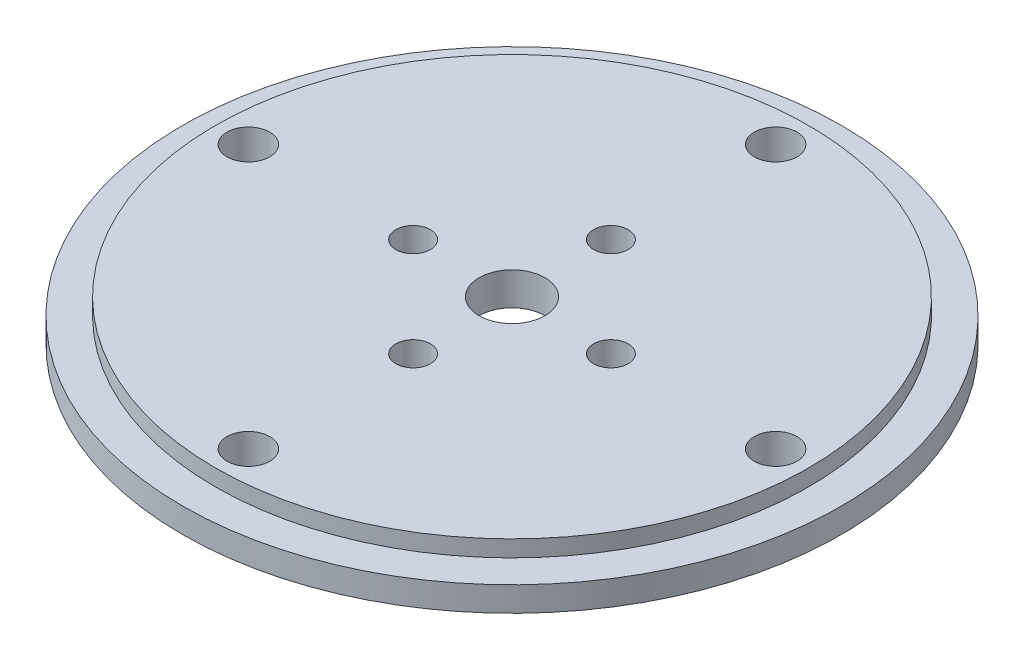
ISO-10303-21;
HEADER;
FILE_DESCRIPTION(('STEP AP214'),'2;1');
FILE_NAME('part.step','',(''),(''),'','','');
FILE_SCHEMA(('AUTOMOTIVE_DESIGN { 1 0 10303 214 1 1 1 1 }'));
ENDSEC;
DATA;
#1=APPLICATION_CONTEXT('core data for automotive mechanical design processes');
#2=APPLICATION_PROTOCOL_DEFINITION('international standard','automotive_design',2000,#1);
#3=PRODUCT_CONTEXT('',#1,'mechanical');
#4=PRODUCT('Part','Part','',(#3));
#5=PRODUCT_RELATED_PRODUCT_CATEGORY('part','',(#4));
#6=PRODUCT_DEFINITION_FORMATION('','',#4);
#7=PRODUCT_DEFINITION_CONTEXT('part definition',#1,'design');
#8=PRODUCT_DEFINITION('design','',#6,#7);
#9=PRODUCT_DEFINITION_SHAPE('','',#8);
#10=(LENGTH_UNIT() NAMED_UNIT(*) SI_UNIT(.MILLI.,.METRE.));
#11=(NAMED_UNIT(*) PLANE_ANGLE_UNIT() SI_UNIT($,.RADIAN.));
#12=(NAMED_UNIT(*) SI_UNIT($,.STERADIAN.) SOLID_ANGLE_UNIT());
#13=UNCERTAINTY_MEASURE_WITH_UNIT(LENGTH_MEASURE(1.E-05),#10,'distance_accuracy_value','');
#14=(GEOMETRIC_REPRESENTATION_CONTEXT(3) GLOBAL_UNCERTAINTY_ASSIGNED_CONTEXT((#13)) GLOBAL_UNIT_ASSIGNED_CONTEXT((#10,
#11,#12)) REPRESENTATION_CONTEXT('',''));
#15=CARTESIAN_POINT('',(0.,0.,0.));
#16=DIRECTION('',(0.,0.,1.));
#17=DIRECTION('',(1.,0.,0.));
#18=AXIS2_PLACEMENT_3D('',#15,#16,#17);
#19=CARTESIAN_POINT('',(-3.35182208528941E-13,5.,-32.));
#20=DIRECTION('',(0.,-1.,0.));
#21=DIRECTION('',(0.,0.,-1.));
#22=AXIS2_PLACEMENT_3D('',#19,#20,#21);
#23=CYLINDRICAL_SURFACE('',#22,2.6);
#24=CARTESIAN_POINT('',(-3.35182208528941E-13,5.,-32.));
#25=DIRECTION('',(0.,-1.,0.));
#26=DIRECTION('',(0.,0.,-1.));
#27=AXIS2_PLACEMENT_3D('',#24,#25,#26);
#28=CIRCLE('',#27,2.6);
#29=CARTESIAN_POINT('',(-3.35182208528941E-13,5.,-34.6));
#30=VERTEX_POINT('',#29);
#31=EDGE_CURVE('E74',#30,#30,#28,.T.);
#32=ORIENTED_EDGE('',*,*,#31,.F.);
#33=EDGE_LOOP('',(#32));
#34=FACE_BOUND('',#33,.T.);
#35=CARTESIAN_POINT('',(-3.35182208528941E-13,1.,-32.));
#36=DIRECTION('',(0.,-1.,0.));
#37=DIRECTION('',(0.,0.,-1.));
#38=AXIS2_PLACEMENT_3D('',#35,#36,#37);
#39=CIRCLE('',#38,2.6);
#40=CARTESIAN_POINT('',(-3.35182208528941E-13,1.,-34.6));
#41=VERTEX_POINT('',#40);
#42=EDGE_CURVE('E41',#41,#41,#39,.F.);
#43=ORIENTED_EDGE('',*,*,#42,.F.);
#44=EDGE_LOOP('',(#43));
#45=FACE_BOUND('',#44,.T.);
#46=ADVANCED_FACE('F37',(#34,#45),#23,.F.);
#47=CARTESIAN_POINT('',(32.,5.,-2.23454805685961E-13));
#48=DIRECTION('',(0.,-1.,0.));
#49=DIRECTION('',(0.,0.,-1.));
#50=AXIS2_PLACEMENT_3D('',#47,#48,#49);
#51=CYLINDRICAL_SURFACE('',#50,2.6);
#52=CARTESIAN_POINT('',(32.,5.,-2.23454805685961E-13));
#53=DIRECTION('',(0.,-1.,0.));
#54=DIRECTION('',(0.,0.,-1.));
#55=AXIS2_PLACEMENT_3D('',#52,#53,#54);
#56=CIRCLE('',#55,2.6);
#57=CARTESIAN_POINT('',(32.,5.,-2.60000000000022));
#58=VERTEX_POINT('',#57);
#59=EDGE_CURVE('E78',#58,#58,#56,.T.);
#60=ORIENTED_EDGE('',*,*,#59,.F.);
#61=EDGE_LOOP('',(#60));
#62=FACE_BOUND('',#61,.T.);
#63=CARTESIAN_POINT('',(32.,1.,-2.23454805685961E-13));
#64=DIRECTION('',(0.,-1.,0.));
#65=DIRECTION('',(0.,0.,-1.));
#66=AXIS2_PLACEMENT_3D('',#63,#64,#65);
#67=CIRCLE('',#66,2.6);
#68=CARTESIAN_POINT('',(32.,1.,-2.60000000000022));
#69=VERTEX_POINT('',#68);
#70=EDGE_CURVE('E69',#69,#69,#67,.F.);
#71=ORIENTED_EDGE('',*,*,#70,.F.);
#72=EDGE_LOOP('',(#71));
#73=FACE_BOUND('',#72,.T.);
#74=ADVANCED_FACE('F151',(#62,#73),#51,.F.);
#75=CARTESIAN_POINT('',(1.1172740284298E-13,5.,32.));
#76=DIRECTION('',(0.,-1.,0.));
#77=DIRECTION('',(0.,0.,-1.));
#78=AXIS2_PLACEMENT_3D('',#75,#76,#77);
#79=CYLINDRICAL_SURFACE('',#78,2.6);
#80=CARTESIAN_POINT('',(1.1172740284298E-13,5.,32.));
#81=DIRECTION('',(0.,-1.,0.));
#82=DIRECTION('',(0.,0.,-1.));
#83=AXIS2_PLACEMENT_3D('',#80,#81,#82);
#84=CIRCLE('',#83,2.6);
#85=CARTESIAN_POINT('',(1.1172740284298E-13,5.,29.4));
#86=VERTEX_POINT('',#85);
#87=EDGE_CURVE('E83',#86,#86,#84,.T.);
#88=ORIENTED_EDGE('',*,*,#87,.F.);
#89=EDGE_LOOP('',(#88));
#90=FACE_BOUND('',#89,.T.);
#91=CARTESIAN_POINT('',(1.1172740284298E-13,1.,32.));
#92=DIRECTION('',(0.,-1.,0.));
#93=DIRECTION('',(0.,0.,-1.));
#94=AXIS2_PLACEMENT_3D('',#91,#92,#93);
#95=CIRCLE('',#94,2.6);
#96=CARTESIAN_POINT('',(1.1172740284298E-13,1.,29.4));
#97=VERTEX_POINT('',#96);
#98=EDGE_CURVE('E66',#97,#97,#95,.F.);
#99=ORIENTED_EDGE('',*,*,#98,.F.);
#100=EDGE_LOOP('',(#99));
#101=FACE_BOUND('',#100,.T.);
#102=ADVANCED_FACE('F145',(#90,#101),#79,.F.);
#103=CARTESIAN_POINT('',(-32.,5.,0.));
#104=DIRECTION('',(0.,-1.,0.));
#105=DIRECTION('',(0.,0.,-1.));
#106=AXIS2_PLACEMENT_3D('',#103,#104,#105);
#107=CYLINDRICAL_SURFACE('',#106,2.6);
#108=CARTESIAN_POINT('',(-32.,5.,0.));
#109=DIRECTION('',(0.,-1.,0.));
#110=DIRECTION('',(0.,0.,-1.));
#111=AXIS2_PLACEMENT_3D('',#108,#109,#110);
#112=CIRCLE('',#111,2.6);
#113=CARTESIAN_POINT('',(-32.,5.,-2.6));
#114=VERTEX_POINT('',#113);
#115=EDGE_CURVE('E92',#114,#114,#112,.T.);
#116=ORIENTED_EDGE('',*,*,#115,.F.);
#117=EDGE_LOOP('',(#116));
#118=FACE_BOUND('',#117,.T.);
#119=CARTESIAN_POINT('',(-32.,1.,0.));
#120=DIRECTION('',(0.,-1.,0.));
#121=DIRECTION('',(0.,0.,-1.));
#122=AXIS2_PLACEMENT_3D('',#119,#120,#121);
#123=CIRCLE('',#122,2.6);
#124=CARTESIAN_POINT('',(-32.,1.,-2.6));
#125=VERTEX_POINT('',#124);
#126=EDGE_CURVE('E63',#125,#125,#123,.F.);
#127=ORIENTED_EDGE('',*,*,#126,.F.);
#128=EDGE_LOOP('',(#127));
#129=FACE_BOUND('',#128,.T.);
#130=ADVANCED_FACE('F139',(#118,#129),#107,.F.);
#131=CARTESIAN_POINT('',(0.,5.,0.));
#132=DIRECTION('',(0.,-1.,0.));
#133=DIRECTION('',(0.,0.,-1.));
#134=AXIS2_PLACEMENT_3D('',#131,#132,#133);
#135=CYLINDRICAL_SURFACE('',#134,4.);
#136=CARTESIAN_POINT('',(0.,5.,0.));
#137=DIRECTION('',(0.,-1.,0.));
#138=DIRECTION('',(0.,0.,-1.));
#139=AXIS2_PLACEMENT_3D('',#136,#137,#138);
#140=CIRCLE('',#139,4.);
#141=CARTESIAN_POINT('',(0.,5.,-4.));
#142=VERTEX_POINT('',#141);
#143=EDGE_CURVE('E108',#142,#142,#140,.T.);
#144=ORIENTED_EDGE('',*,*,#143,.F.);
#145=EDGE_LOOP('',(#144));
#146=FACE_BOUND('',#145,.T.);
#147=CARTESIAN_POINT('',(0.,1.,0.));
#148=DIRECTION('',(0.,-1.,0.));
#149=DIRECTION('',(0.,0.,-1.));
#150=AXIS2_PLACEMENT_3D('',#147,#148,#149);
#151=CIRCLE('',#150,4.);
#152=CARTESIAN_POINT('',(0.,1.,-4.));
#153=VERTEX_POINT('',#152);
#154=EDGE_CURVE('E101',#153,#153,#151,.F.);
#155=ORIENTED_EDGE('',*,*,#154,.F.);
#156=EDGE_LOOP('',(#155));
#157=FACE_BOUND('',#156,.T.);
#158=ADVANCED_FACE('F126',(#146,#157),#135,.F.);
#159=CARTESIAN_POINT('',(0.,5.,12.));
#160=DIRECTION('',(0.,-1.,0.));
#161=DIRECTION('',(0.,0.,-1.));
#162=AXIS2_PLACEMENT_3D('',#159,#160,#161);
#163=CYLINDRICAL_SURFACE('',#162,2.1);
#164=CARTESIAN_POINT('',(0.,5.,12.));
#165=DIRECTION('',(0.,-1.,0.));
#166=DIRECTION('',(0.,0.,-1.));
#167=AXIS2_PLACEMENT_3D('',#164,#165,#166);
#168=CIRCLE('',#167,2.1);
#169=CARTESIAN_POINT('',(0.,5.,9.9));
#170=VERTEX_POINT('',#169);
#171=EDGE_CURVE('E112',#170,#170,#168,.T.);
#172=ORIENTED_EDGE('',*,*,#171,.F.);
#173=EDGE_LOOP('',(#172));
#174=FACE_BOUND('',#173,.T.);
#175=CARTESIAN_POINT('',(0.,1.,12.));
#176=DIRECTION('',(0.,-1.,0.));
#177=DIRECTION('',(0.,0.,-1.));
#178=AXIS2_PLACEMENT_3D('',#175,#176,#177);
#179=CIRCLE('',#178,2.1);
#180=CARTESIAN_POINT('',(0.,1.,9.9));
#181=VERTEX_POINT('',#180);
#182=EDGE_CURVE('E98',#181,#181,#179,.F.);
#183=ORIENTED_EDGE('',*,*,#182,.F.);
#184=EDGE_LOOP('',(#183));
#185=FACE_BOUND('',#184,.T.);
#186=ADVANCED_FACE('F122',(#174,#185),#163,.F.);
#187=CARTESIAN_POINT('',(12.,5.,0.));
#188=DIRECTION('',(0.,-1.,0.));
#189=DIRECTION('',(0.,0.,-1.));
#190=AXIS2_PLACEMENT_3D('',#187,#188,#189);
#191=CYLINDRICAL_SURFACE('',#190,2.1);
#192=CARTESIAN_POINT('',(12.,5.,0.));
#193=DIRECTION('',(0.,-1.,0.));
#194=DIRECTION('',(0.,0.,-1.));
#195=AXIS2_PLACEMENT_3D('',#192,#193,#194);
#196=CIRCLE('',#195,2.1);
#197=CARTESIAN_POINT('',(12.,5.,-2.10000000000008));
#198=VERTEX_POINT('',#197);
#199=EDGE_CURVE('E109',#198,#198,#196,.T.);
#200=ORIENTED_EDGE('',*,*,#199,.F.);
#201=EDGE_LOOP('',(#200));
#202=FACE_BOUND('',#201,.T.);
#203=CARTESIAN_POINT('',(12.,1.,0.));
#204=DIRECTION('',(0.,-1.,0.));
#205=DIRECTION('',(0.,0.,-1.));
#206=AXIS2_PLACEMENT_3D('',#203,#204,#205);
#207=CIRCLE('',#206,2.1);
#208=CARTESIAN_POINT('',(12.,1.,-2.10000000000008));
#209=VERTEX_POINT('',#208);
#210=EDGE_CURVE('E95',#209,#209,#207,.F.);
#211=ORIENTED_EDGE('',*,*,#210,.F.);
#212=EDGE_LOOP('',(#211));
#213=FACE_BOUND('',#212,.T.);
#214=ADVANCED_FACE('F125',(#202,#213),#191,.F.);
#215=CARTESIAN_POINT('',(-1.25693328198353E-13,5.,-12.));
#216=DIRECTION('',(0.,-1.,0.));
#217=DIRECTION('',(0.,0.,-1.));
#218=AXIS2_PLACEMENT_3D('',#215,#216,#217);
#219=CYLINDRICAL_SURFACE('',#218,2.1);
#220=CARTESIAN_POINT('',(-1.25693328198353E-13,5.,-12.));
#221=DIRECTION('',(0.,-1.,0.));
#222=DIRECTION('',(0.,0.,-1.));
#223=AXIS2_PLACEMENT_3D('',#220,#221,#222);
#224=CIRCLE('',#223,2.1);
#225=CARTESIAN_POINT('',(-1.25693328198353E-13,5.,-14.1));
#226=VERTEX_POINT('',#225);
#227=EDGE_CURVE('E104',#226,#226,#224,.T.);
#228=ORIENTED_EDGE('',*,*,#227,.F.);
#229=EDGE_LOOP('',(#228));
#230=FACE_BOUND('',#229,.T.);
#231=CARTESIAN_POINT('',(-1.25693328198353E-13,1.,-12.));
#232=DIRECTION('',(0.,-1.,0.));
#233=DIRECTION('',(0.,0.,-1.));
#234=AXIS2_PLACEMENT_3D('',#231,#232,#233);
#235=CIRCLE('',#234,2.1);
#236=CARTESIAN_POINT('',(-1.25693328198353E-13,1.,-14.1));
#237=VERTEX_POINT('',#236);
#238=EDGE_CURVE('E61',#237,#237,#235,.F.);
#239=ORIENTED_EDGE('',*,*,#238,.F.);
#240=EDGE_LOOP('',(#239));
#241=FACE_BOUND('',#240,.T.);
#242=ADVANCED_FACE('F169',(#230,#241),#219,.F.);
#243=CARTESIAN_POINT('',(-12.,5.,0.));
#244=DIRECTION('',(0.,-1.,0.));
#245=DIRECTION('',(0.,0.,-1.));
#246=AXIS2_PLACEMENT_3D('',#243,#244,#245);
#247=CYLINDRICAL_SURFACE('',#246,2.1);
#248=CARTESIAN_POINT('',(-12.,5.,0.));
#249=DIRECTION('',(0.,-1.,0.));
#250=DIRECTION('',(0.,0.,-1.));
#251=AXIS2_PLACEMENT_3D('',#248,#249,#250);
#252=CIRCLE('',#251,2.1);
#253=CARTESIAN_POINT('',(-12.,5.,-2.1));
#254=VERTEX_POINT('',#253);
#255=EDGE_CURVE('E105',#254,#254,#252,.T.);
#256=ORIENTED_EDGE('',*,*,#255,.F.);
#257=EDGE_LOOP('',(#256));
#258=FACE_BOUND('',#257,.T.);
#259=CARTESIAN_POINT('',(-12.,1.,0.));
#260=DIRECTION('',(0.,-1.,0.));
#261=DIRECTION('',(0.,0.,-1.));
#262=AXIS2_PLACEMENT_3D('',#259,#260,#261);
#263=CIRCLE('',#262,2.1);
#264=CARTESIAN_POINT('',(-12.,1.,-2.1));
#265=VERTEX_POINT('',#264);
#266=EDGE_CURVE('E58',#265,#265,#263,.F.);
#267=ORIENTED_EDGE('',*,*,#266,.F.);
#268=EDGE_LOOP('',(#267));
#269=FACE_BOUND('',#268,.T.);
#270=ADVANCED_FACE('F166',(#258,#269),#247,.F.);
#271=CARTESIAN_POINT('',(0.,3.,0.));
#272=DIRECTION('',(0.,-1.,0.));
#273=DIRECTION('',(0.,0.,-1.));
#274=AXIS2_PLACEMENT_3D('',#271,#272,#273);
#275=CYLINDRICAL_SURFACE('',#274,40.);
#276=CARTESIAN_POINT('',(0.,3.,0.));
#277=DIRECTION('',(0.,1.,0.));
#278=DIRECTION('',(0.,0.,1.));
#279=AXIS2_PLACEMENT_3D('',#276,#277,#278);
#280=CIRCLE('',#279,40.);
#281=CARTESIAN_POINT('',(0.,3.,40.));
#282=VERTEX_POINT('',#281);
#283=EDGE_CURVE('E45',#282,#282,#280,.T.);
#284=ORIENTED_EDGE('',*,*,#283,.F.);
#285=EDGE_LOOP('',(#284));
#286=FACE_BOUND('',#285,.T.);
#287=CARTESIAN_POINT('',(0.,0.,0.));
#288=DIRECTION('',(0.,1.,0.));
#289=DIRECTION('',(0.,0.,1.));
#290=AXIS2_PLACEMENT_3D('',#287,#288,#289);
#291=CIRCLE('',#290,40.);
#292=CARTESIAN_POINT('',(0.,0.,40.));
#293=VERTEX_POINT('',#292);
#294=EDGE_CURVE('E50',#293,#293,#291,.T.);
#295=ORIENTED_EDGE('',*,*,#294,.T.);
#296=EDGE_LOOP('',(#295));
#297=FACE_BOUND('',#296,.T.);
#298=ADVANCED_FACE('F39',(#286,#297),#275,.T.);
#299=CARTESIAN_POINT('',(0.,3.,0.));
#300=DIRECTION('',(0.,1.,0.));
#301=DIRECTION('',(0.,0.,1.));
#302=AXIS2_PLACEMENT_3D('',#299,#300,#301);
#303=PLANE('',#302);
#304=CARTESIAN_POINT('',(0.,3.,0.));
#305=DIRECTION('',(0.,1.,0.));
#306=DIRECTION('',(0.,0.,1.));
#307=AXIS2_PLACEMENT_3D('',#304,#305,#306);
#308=CIRCLE('',#307,36.);
#309=CARTESIAN_POINT('',(0.,3.,36.));
#310=VERTEX_POINT('',#309);
#311=EDGE_CURVE('E10',#310,#310,#308,.T.);
#312=ORIENTED_EDGE('',*,*,#311,.F.);
#313=EDGE_LOOP('',(#312));
#314=FACE_BOUND('',#313,.T.);
#315=ORIENTED_EDGE('',*,*,#283,.T.);
#316=EDGE_LOOP('',(#315));
#317=FACE_BOUND('',#316,.T.);
#318=ADVANCED_FACE('F200',(#314,#317),#303,.T.);
#319=CARTESIAN_POINT('',(0.,0.,0.));
#320=DIRECTION('',(0.,1.,0.));
#321=DIRECTION('',(0.,0.,1.));
#322=AXIS2_PLACEMENT_3D('',#319,#320,#321);
#323=PLANE('',#322);
#324=CARTESIAN_POINT('',(-3.35182208528941E-13,0.,-32.));
#325=DIRECTION('',(0.,-1.,0.));
#326=DIRECTION('',(0.,0.,-1.));
#327=AXIS2_PLACEMENT_3D('',#324,#325,#326);
#328=CIRCLE('',#327,5.);
#329=CARTESIAN_POINT('',(-3.35182208528941E-13,0.,-37.));
#330=VERTEX_POINT('',#329);
#331=EDGE_CURVE('E210',#330,#330,#328,.T.);
#332=ORIENTED_EDGE('',*,*,#331,.F.);
#333=EDGE_LOOP('',(#332));
#334=FACE_BOUND('',#333,.T.);
#335=CARTESIAN_POINT('',(32.,0.,-2.23454805685961E-13));
#336=DIRECTION('',(0.,-1.,0.));
#337=DIRECTION('',(0.,0.,-1.));
#338=AXIS2_PLACEMENT_3D('',#335,#336,#337);
#339=CIRCLE('',#338,5.);
#340=CARTESIAN_POINT('',(32.,0.,-5.00000000000022));
#341=VERTEX_POINT('',#340);
#342=EDGE_CURVE('E214',#341,#341,#339,.T.);
#343=ORIENTED_EDGE('',*,*,#342,.F.);
#344=EDGE_LOOP('',(#343));
#345=FACE_BOUND('',#344,.T.);
#346=CARTESIAN_POINT('',(1.1172740284298E-13,0.,32.));
#347=DIRECTION('',(0.,-1.,0.));
#348=DIRECTION('',(0.,0.,-1.));
#349=AXIS2_PLACEMENT_3D('',#346,#347,#348);
#350=CIRCLE('',#349,5.);
#351=CARTESIAN_POINT('',(1.1172740284298E-13,0.,27.));
#352=VERTEX_POINT('',#351);
#353=EDGE_CURVE('E218',#352,#352,#350,.T.);
#354=ORIENTED_EDGE('',*,*,#353,.F.);
#355=EDGE_LOOP('',(#354));
#356=FACE_BOUND('',#355,.T.);
#357=CARTESIAN_POINT('',(-32.,0.,0.));
#358=DIRECTION('',(0.,-1.,0.));
#359=DIRECTION('',(0.,0.,-1.));
#360=AXIS2_PLACEMENT_3D('',#357,#358,#359);
#361=CIRCLE('',#360,5.);
#362=CARTESIAN_POINT('',(-32.,0.,-5.));
#363=VERTEX_POINT('',#362);
#364=EDGE_CURVE('E222',#363,#363,#361,.T.);
#365=ORIENTED_EDGE('',*,*,#364,.F.);
#366=EDGE_LOOP('',(#365));
#367=FACE_BOUND('',#366,.T.);
#368=CARTESIAN_POINT('',(0.,0.,0.));
#369=DIRECTION('',(0.,-1.,0.));
#370=DIRECTION('',(0.,0.,-1.));
#371=AXIS2_PLACEMENT_3D('',#368,#369,#370);
#372=CIRCLE('',#371,16.1);
#373=CARTESIAN_POINT('',(0.,0.,-16.1));
#374=VERTEX_POINT('',#373);
#375=EDGE_CURVE('E89',#374,#374,#372,.T.);
#376=ORIENTED_EDGE('',*,*,#375,.F.);
#377=EDGE_LOOP('',(#376));
#378=FACE_BOUND('',#377,.T.);
#379=ORIENTED_EDGE('',*,*,#294,.F.);
#380=EDGE_LOOP('',(#379));
#381=FACE_BOUND('',#380,.T.);
#382=ADVANCED_FACE('F194',(#334,#345,#356,#367,#378,#381),#323,.F.);
#383=CARTESIAN_POINT('',(0.,5.,0.));
#384=DIRECTION('',(0.,-1.,0.));
#385=DIRECTION('',(0.,0.,-1.));
#386=AXIS2_PLACEMENT_3D('',#383,#384,#385);
#387=CYLINDRICAL_SURFACE('',#386,36.);
#388=CARTESIAN_POINT('',(0.,5.,0.));
#389=DIRECTION('',(0.,1.,0.));
#390=DIRECTION('',(0.,0.,1.));
#391=AXIS2_PLACEMENT_3D('',#388,#389,#390);
#392=CIRCLE('',#391,36.);
#393=CARTESIAN_POINT('',(0.,5.,36.));
#394=VERTEX_POINT('',#393);
#395=EDGE_CURVE('E53',#394,#394,#392,.T.);
#396=ORIENTED_EDGE('',*,*,#395,.F.);
#397=EDGE_LOOP('',(#396));
#398=FACE_BOUND('',#397,.T.);
#399=ORIENTED_EDGE('',*,*,#311,.T.);
#400=EDGE_LOOP('',(#399));
#401=FACE_BOUND('',#400,.T.);
#402=ADVANCED_FACE('F187',(#398,#401),#387,.T.);
#403=CARTESIAN_POINT('',(0.,5.,0.));
#404=DIRECTION('',(0.,1.,0.));
#405=DIRECTION('',(0.,0.,1.));
#406=AXIS2_PLACEMENT_3D('',#403,#404,#405);
#407=PLANE('',#406);
#408=ORIENTED_EDGE('',*,*,#115,.T.);
#409=EDGE_LOOP('',(#408));
#410=FACE_BOUND('',#409,.T.);
#411=ORIENTED_EDGE('',*,*,#87,.T.);
#412=EDGE_LOOP('',(#411));
#413=FACE_BOUND('',#412,.T.);
#414=ORIENTED_EDGE('',*,*,#59,.T.);
#415=EDGE_LOOP('',(#414));
#416=FACE_BOUND('',#415,.T.);
#417=ORIENTED_EDGE('',*,*,#31,.T.);
#418=EDGE_LOOP('',(#417));
#419=FACE_BOUND('',#418,.T.);
#420=ORIENTED_EDGE('',*,*,#255,.T.);
#421=EDGE_LOOP('',(#420));
#422=FACE_BOUND('',#421,.T.);
#423=ORIENTED_EDGE('',*,*,#227,.T.);
#424=EDGE_LOOP('',(#423));
#425=FACE_BOUND('',#424,.T.);
#426=ORIENTED_EDGE('',*,*,#199,.T.);
#427=EDGE_LOOP('',(#426));
#428=FACE_BOUND('',#427,.T.);
#429=ORIENTED_EDGE('',*,*,#171,.T.);
#430=EDGE_LOOP('',(#429));
#431=FACE_BOUND('',#430,.T.);
#432=ORIENTED_EDGE('',*,*,#143,.T.);
#433=EDGE_LOOP('',(#432));
#434=FACE_BOUND('',#433,.T.);
#435=ORIENTED_EDGE('',*,*,#395,.T.);
#436=EDGE_LOOP('',(#435));
#437=FACE_BOUND('',#436,.T.);
#438=ADVANCED_FACE('F119',(#410,#413,#416,#419,#422,#425,#428,#431,#434,#437),#407,.T.);
#439=CARTESIAN_POINT('',(0.,1.,0.));
#440=DIRECTION('',(0.,-1.,0.));
#441=DIRECTION('',(0.,0.,-1.));
#442=AXIS2_PLACEMENT_3D('',#439,#440,#441);
#443=PLANE('',#442);
#444=CARTESIAN_POINT('',(0.,1.,0.));
#445=DIRECTION('',(0.,-1.,0.));
#446=DIRECTION('',(0.,0.,-1.));
#447=AXIS2_PLACEMENT_3D('',#444,#445,#446);
#448=CIRCLE('',#447,16.1);
#449=CARTESIAN_POINT('',(0.,1.,-16.1));
#450=VERTEX_POINT('',#449);
#451=EDGE_CURVE('E62',#450,#450,#448,.T.);
#452=ORIENTED_EDGE('',*,*,#451,.T.);
#453=EDGE_LOOP('',(#452));
#454=FACE_BOUND('',#453,.T.);
#455=ORIENTED_EDGE('',*,*,#266,.T.);
#456=EDGE_LOOP('',(#455));
#457=FACE_BOUND('',#456,.T.);
#458=ORIENTED_EDGE('',*,*,#238,.T.);
#459=EDGE_LOOP('',(#458));
#460=FACE_BOUND('',#459,.T.);
#461=ORIENTED_EDGE('',*,*,#210,.T.);
#462=EDGE_LOOP('',(#461));
#463=FACE_BOUND('',#462,.T.);
#464=ORIENTED_EDGE('',*,*,#182,.T.);
#465=EDGE_LOOP('',(#464));
#466=FACE_BOUND('',#465,.T.);
#467=ORIENTED_EDGE('',*,*,#154,.T.);
#468=EDGE_LOOP('',(#467));
#469=FACE_BOUND('',#468,.T.);
#470=ADVANCED_FACE('F130',(#454,#457,#460,#463,#466,#469),#443,.T.);
#471=CARTESIAN_POINT('',(0.,1.,0.));
#472=DIRECTION('',(0.,-1.,0.));
#473=DIRECTION('',(0.,0.,-1.));
#474=AXIS2_PLACEMENT_3D('',#471,#472,#473);
#475=CYLINDRICAL_SURFACE('',#474,16.1);
#476=ORIENTED_EDGE('',*,*,#451,.F.);
#477=EDGE_LOOP('',(#476));
#478=FACE_BOUND('',#477,.T.);
#479=ORIENTED_EDGE('',*,*,#375,.T.);
#480=EDGE_LOOP('',(#479));
#481=FACE_BOUND('',#480,.T.);
#482=ADVANCED_FACE('F133',(#478,#481),#475,.F.);
#483=CARTESIAN_POINT('',(-32.,1.,0.));
#484=DIRECTION('',(0.,-1.,0.));
#485=DIRECTION('',(0.,0.,-1.));
#486=AXIS2_PLACEMENT_3D('',#483,#484,#485);
#487=PLANE('',#486);
#488=CARTESIAN_POINT('',(-32.,1.,0.));
#489=DIRECTION('',(0.,-1.,0.));
#490=DIRECTION('',(0.,0.,-1.));
#491=AXIS2_PLACEMENT_3D('',#488,#489,#490);
#492=CIRCLE('',#491,5.);
#493=CARTESIAN_POINT('',(-32.,1.,-5.));
#494=VERTEX_POINT('',#493);
#495=EDGE_CURVE('E433',#494,#494,#492,.T.);
#496=ORIENTED_EDGE('',*,*,#495,.T.);
#497=EDGE_LOOP('',(#496));
#498=FACE_BOUND('',#497,.T.);
#499=ORIENTED_EDGE('',*,*,#126,.T.);
#500=EDGE_LOOP('',(#499));
#501=FACE_BOUND('',#500,.T.);
#502=ADVANCED_FACE('F164',(#498,#501),#487,.T.);
#503=CARTESIAN_POINT('',(-32.,1.,0.));
#504=DIRECTION('',(0.,-1.,0.));
#505=DIRECTION('',(0.,0.,-1.));
#506=AXIS2_PLACEMENT_3D('',#503,#504,#505);
#507=CYLINDRICAL_SURFACE('',#506,5.);
#508=ORIENTED_EDGE('',*,*,#495,.F.);
#509=EDGE_LOOP('',(#508));
#510=FACE_BOUND('',#509,.T.);
#511=ORIENTED_EDGE('',*,*,#364,.T.);
#512=EDGE_LOOP('',(#511));
#513=FACE_BOUND('',#512,.T.);
#514=ADVANCED_FACE('F329',(#510,#513),#507,.F.);
#515=CARTESIAN_POINT('',(1.1172740284298E-13,1.,32.));
#516=DIRECTION('',(0.,-1.,0.));
#517=DIRECTION('',(0.,0.,-1.));
#518=AXIS2_PLACEMENT_3D('',#515,#516,#517);
#519=PLANE('',#518);
#520=CARTESIAN_POINT('',(1.1172740284298E-13,1.,32.));
#521=DIRECTION('',(0.,-1.,0.));
#522=DIRECTION('',(0.,0.,-1.));
#523=AXIS2_PLACEMENT_3D('',#520,#521,#522);
#524=CIRCLE('',#523,5.);
#525=CARTESIAN_POINT('',(1.1172740284298E-13,1.,27.));
#526=VERTEX_POINT('',#525);
#527=EDGE_CURVE('E429',#526,#526,#524,.T.);
#528=ORIENTED_EDGE('',*,*,#527,.T.);
#529=EDGE_LOOP('',(#528));
#530=FACE_BOUND('',#529,.T.);
#531=ORIENTED_EDGE('',*,*,#98,.T.);
#532=EDGE_LOOP('',(#531));
#533=FACE_BOUND('',#532,.T.);
#534=ADVANCED_FACE('F339',(#530,#533),#519,.T.);
#535=CARTESIAN_POINT('',(1.1172740284298E-13,1.,32.));
#536=DIRECTION('',(0.,-1.,0.));
#537=DIRECTION('',(0.,0.,-1.));
#538=AXIS2_PLACEMENT_3D('',#535,#536,#537);
#539=CYLINDRICAL_SURFACE('',#538,5.);
#540=ORIENTED_EDGE('',*,*,#527,.F.);
#541=EDGE_LOOP('',(#540));
#542=FACE_BOUND('',#541,.T.);
#543=ORIENTED_EDGE('',*,*,#353,.T.);
#544=EDGE_LOOP('',(#543));
#545=FACE_BOUND('',#544,.T.);
#546=ADVANCED_FACE('F350',(#542,#545),#539,.F.);
#547=CARTESIAN_POINT('',(32.,1.,-2.23454805685961E-13));
#548=DIRECTION('',(0.,-1.,0.));
#549=DIRECTION('',(0.,0.,-1.));
#550=AXIS2_PLACEMENT_3D('',#547,#548,#549);
#551=PLANE('',#550);
#552=CARTESIAN_POINT('',(32.,1.,-2.23454805685961E-13));
#553=DIRECTION('',(0.,-1.,0.));
#554=DIRECTION('',(0.,0.,-1.));
#555=AXIS2_PLACEMENT_3D('',#552,#553,#554);
#556=CIRCLE('',#555,5.);
#557=CARTESIAN_POINT('',(32.,1.,-5.00000000000022));
#558=VERTEX_POINT('',#557);
#559=EDGE_CURVE('E423',#558,#558,#556,.T.);
#560=ORIENTED_EDGE('',*,*,#559,.T.);
#561=EDGE_LOOP('',(#560));
#562=FACE_BOUND('',#561,.T.);
#563=ORIENTED_EDGE('',*,*,#70,.T.);
#564=EDGE_LOOP('',(#563));
#565=FACE_BOUND('',#564,.T.);
#566=ADVANCED_FACE('F361',(#562,#565),#551,.T.);
#567=CARTESIAN_POINT('',(32.,1.,-2.23454805685961E-13));
#568=DIRECTION('',(0.,-1.,0.));
#569=DIRECTION('',(0.,0.,-1.));
#570=AXIS2_PLACEMENT_3D('',#567,#568,#569);
#571=CYLINDRICAL_SURFACE('',#570,5.);
#572=ORIENTED_EDGE('',*,*,#559,.F.);
#573=EDGE_LOOP('',(#572));
#574=FACE_BOUND('',#573,.T.);
#575=ORIENTED_EDGE('',*,*,#342,.T.);
#576=EDGE_LOOP('',(#575));
#577=FACE_BOUND('',#576,.T.);
#578=ADVANCED_FACE('F372',(#574,#577),#571,.F.);
#579=CARTESIAN_POINT('',(-3.35182208528941E-13,1.,-32.));
#580=DIRECTION('',(0.,-1.,0.));
#581=DIRECTION('',(0.,0.,-1.));
#582=AXIS2_PLACEMENT_3D('',#579,#580,#581);
#583=PLANE('',#582);
#584=CARTESIAN_POINT('',(-3.35182208528941E-13,1.,-32.));
#585=DIRECTION('',(0.,-1.,0.));
#586=DIRECTION('',(0.,0.,-1.));
#587=AXIS2_PLACEMENT_3D('',#584,#585,#586);
#588=CIRCLE('',#587,5.);
#589=CARTESIAN_POINT('',(-3.35182208528941E-13,1.,-37.));
#590=VERTEX_POINT('',#589);
#591=EDGE_CURVE('E67',#590,#590,#588,.T.);
#592=ORIENTED_EDGE('',*,*,#591,.T.);
#593=EDGE_LOOP('',(#592));
#594=FACE_BOUND('',#593,.T.);
#595=ORIENTED_EDGE('',*,*,#42,.T.);
#596=EDGE_LOOP('',(#595));
#597=FACE_BOUND('',#596,.T.);
#598=ADVANCED_FACE('F383',(#594,#597),#583,.T.);
#599=CARTESIAN_POINT('',(-3.35182208528941E-13,1.,-32.));
#600=DIRECTION('',(0.,-1.,0.));
#601=DIRECTION('',(0.,0.,-1.));
#602=AXIS2_PLACEMENT_3D('',#599,#600,#601);
#603=CYLINDRICAL_SURFACE('',#602,5.);
#604=ORIENTED_EDGE('',*,*,#591,.F.);
#605=EDGE_LOOP('',(#604));
#606=FACE_BOUND('',#605,.T.);
#607=ORIENTED_EDGE('',*,*,#331,.T.);
#608=EDGE_LOOP('',(#607));
#609=FACE_BOUND('',#608,.T.);
#610=ADVANCED_FACE('F394',(#606,#609),#603,.F.);
#611=CLOSED_SHELL('',(#46,#74,#102,#130,#158,#186,#214,#242,#270,#298,#318,#382,#402,#438,#470,
#482,#502,#514,#534,#546,#566,#578,#598,#610));
#612=MANIFOLD_SOLID_BREP('B2',#611);
#613=ADVANCED_BREP_SHAPE_REPRESENTATION('',(#18,#612),#14);
#614=SHAPE_DEFINITION_REPRESENTATION(#9,#613);
ENDSEC;
END-ISO-10303-21;
